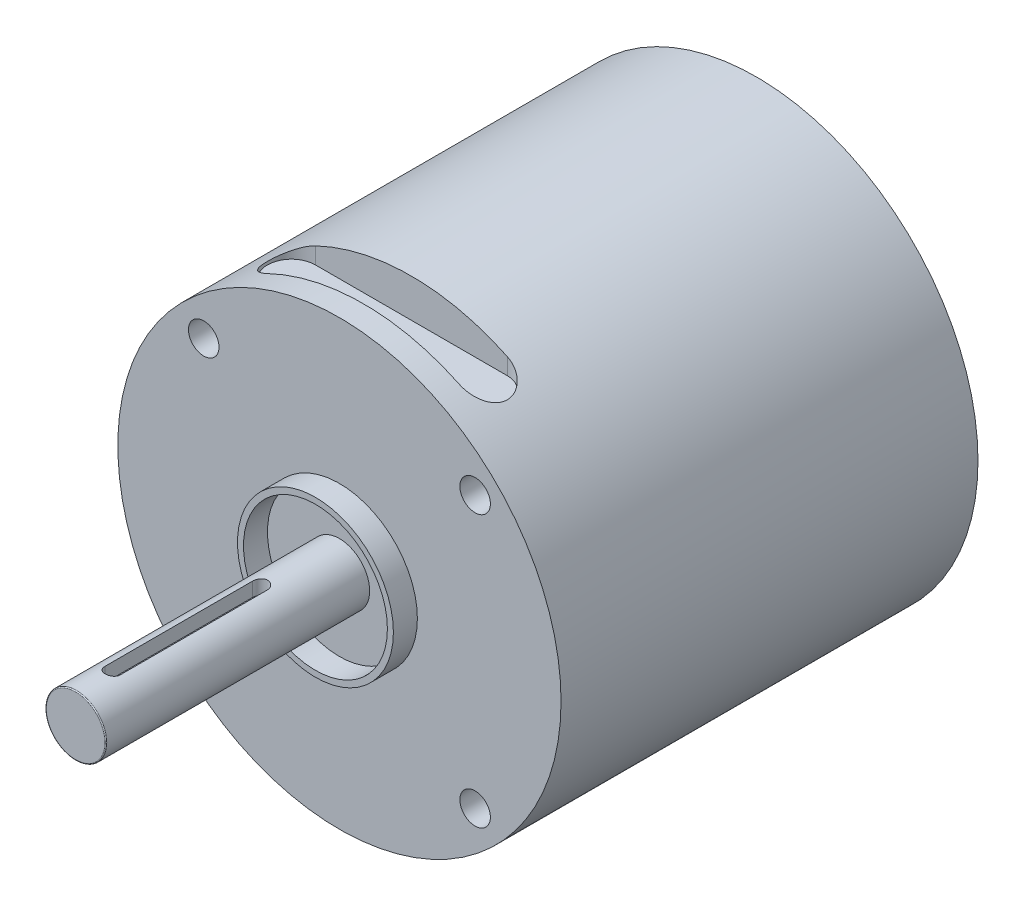
ISO-10303-21;
HEADER;
FILE_DESCRIPTION(('STEP AP214'),'2;1');
FILE_NAME('part.step','',(''),(''),'','','');
FILE_SCHEMA(('AUTOMOTIVE_DESIGN { 1 0 10303 214 1 1 1 1 }'));
ENDSEC;
DATA;
#1=APPLICATION_CONTEXT('core data for automotive mechanical design processes');
#2=APPLICATION_PROTOCOL_DEFINITION('international standard','automotive_design',2000,#1);
#3=PRODUCT_CONTEXT('',#1,'mechanical');
#4=PRODUCT('Part','Part','',(#3));
#5=PRODUCT_RELATED_PRODUCT_CATEGORY('part','',(#4));
#6=PRODUCT_DEFINITION_FORMATION('','',#4);
#7=PRODUCT_DEFINITION_CONTEXT('part definition',#1,'design');
#8=PRODUCT_DEFINITION('design','',#6,#7);
#9=PRODUCT_DEFINITION_SHAPE('','',#8);
#10=(LENGTH_UNIT() NAMED_UNIT(*) SI_UNIT(.MILLI.,.METRE.));
#11=(NAMED_UNIT(*) PLANE_ANGLE_UNIT() SI_UNIT($,.RADIAN.));
#12=(NAMED_UNIT(*) SI_UNIT($,.STERADIAN.) SOLID_ANGLE_UNIT());
#13=UNCERTAINTY_MEASURE_WITH_UNIT(LENGTH_MEASURE(1.E-05),#10,'distance_accuracy_value','');
#14=(GEOMETRIC_REPRESENTATION_CONTEXT(3) GLOBAL_UNCERTAINTY_ASSIGNED_CONTEXT((#13)) GLOBAL_UNIT_ASSIGNED_CONTEXT((#10,
#11,#12)) REPRESENTATION_CONTEXT('',''));
#15=CARTESIAN_POINT('',(0.,0.,0.));
#16=DIRECTION('',(0.,0.,1.));
#17=DIRECTION('',(1.,0.,0.));
#18=AXIS2_PLACEMENT_3D('',#15,#16,#17);
#19=CARTESIAN_POINT('',(0.,0.,55.1942));
#20=DIRECTION('',(0.,0.,-1.));
#21=DIRECTION('',(-1.,0.,0.));
#22=AXIS2_PLACEMENT_3D('',#19,#20,#21);
#23=CYLINDRICAL_SURFACE('',#22,29.337);
#24=CARTESIAN_POINT('',(-12.7,26.4455964009133,52.0192));
#25=CARTESIAN_POINT('',(-12.7999935784026,26.3975802156428,52.0191933741765));
#26=CARTESIAN_POINT('',(-12.899655265305,26.3490169743052,52.0144749423616));
#27=CARTESIAN_POINT('',(-13.0977120096252,26.251127234427,51.9957643735884));
#28=CARTESIAN_POINT('',(-13.1961072165287,26.2018008275064,51.9817733415225));
#29=CARTESIAN_POINT('',(-13.4885884149536,26.0531232640922,51.9261023274076));
#30=CARTESIAN_POINT('',(-13.6799039434946,25.953105530812,51.8707246247511));
#31=CARTESIAN_POINT('',(-14.0496110384805,25.7548462259984,51.7249471615389));
#32=CARTESIAN_POINT('',(-14.2280013685622,25.6566048250532,51.6345440558552));
#33=CARTESIAN_POINT('',(-14.5668381544862,25.4657532274061,51.4201921814478));
#34=CARTESIAN_POINT('',(-14.7272857644863,25.3731426686776,51.2962455721516));
#35=CARTESIAN_POINT('',(-15.0206994706168,25.200523115352,51.0200652959408));
#36=CARTESIAN_POINT('',(-15.1542800023321,25.1202456814382,50.8686661665429));
#37=CARTESIAN_POINT('',(-15.3330664097173,25.0112289116959,50.6212701887228));
#38=CARTESIAN_POINT('',(-15.3890759268016,24.9767826080826,50.5353976668582));
#39=CARTESIAN_POINT('',(-15.4931118185219,24.9123821082004,50.3573926900157));
#40=CARTESIAN_POINT('',(-15.5411441907074,24.8824245387869,50.2652650120195));
#41=CARTESIAN_POINT('',(-15.6226400094675,24.8313248137603,50.0879951492556));
#42=CARTESIAN_POINT('',(-15.6571895301782,24.8095410560846,50.003535122367));
#43=CARTESIAN_POINT('',(-15.7191145403578,24.770352236214,49.8310917216594));
#44=CARTESIAN_POINT('',(-15.7464947056621,24.7529443204042,49.7431106876207));
#45=CARTESIAN_POINT('',(-15.793613952146,24.722906575261,49.5644142848367));
#46=CARTESIAN_POINT('',(-15.8133600487852,24.7102723592969,49.4737015095184));
#47=CARTESIAN_POINT('',(-15.8448728482896,24.6900774961406,49.290347600278));
#48=CARTESIAN_POINT('',(-15.8566408535494,24.6825160208437,49.197706783648));
#49=CARTESIAN_POINT('',(-15.8707954319837,24.6734164087759,49.0257189658045));
#50=CARTESIAN_POINT('',(-15.8743408770911,24.6711343559055,48.9465040132243));
#51=CARTESIAN_POINT('',(-15.8754918636408,24.6703937612768,48.7879846505425));
#52=CARTESIAN_POINT('',(-15.873095509155,24.6719364399259,48.7086802199601));
#53=CARTESIAN_POINT('',(-15.862393935922,24.6788182217864,48.5506819070306));
#54=CARTESIAN_POINT('',(-15.8540922031861,24.6841550852467,48.4719876921579));
#55=CARTESIAN_POINT('',(-15.8317107876766,24.6985156082517,48.3157565640876));
#56=CARTESIAN_POINT('',(-15.8176289171686,24.7075406637409,48.2382201006179));
#57=CARTESIAN_POINT('',(-15.7685698534504,24.7389019726696,48.0154540556941));
#58=CARTESIAN_POINT('',(-15.7262127172989,24.765895142234,47.8724177225665));
#59=CARTESIAN_POINT('',(-15.6230854034192,24.8310783877972,47.5959931113277));
#60=CARTESIAN_POINT('',(-15.5623111550576,24.8692709390736,47.4626069742282));
#61=CARTESIAN_POINT('',(-15.4191329570302,24.9583161461541,47.1975737742838));
#62=CARTESIAN_POINT('',(-15.3353941296849,25.0099335771814,47.0669068992655));
#63=CARTESIAN_POINT('',(-15.1519667889344,25.1214847173408,46.8213274577803));
#64=CARTESIAN_POINT('',(-15.0522715643893,25.1814219242936,46.7064215581905));
#65=CARTESIAN_POINT('',(-14.8243229278951,25.3163768248014,46.4783063228865));
#66=CARTESIAN_POINT('',(-14.6940243605106,25.392325252936,46.3676912994898));
#67=CARTESIAN_POINT('',(-14.4194332344039,25.5492575938961,46.1697153252365));
#68=CARTESIAN_POINT('',(-14.2751273190822,25.6302462858955,46.0823768727172));
#69=CARTESIAN_POINT('',(-13.9559285950078,25.8055997464604,45.9220005065732));
#70=CARTESIAN_POINT('',(-13.7795132413707,25.9003184362395,45.8523747262066));
#71=CARTESIAN_POINT('',(-13.4173437426021,26.0897695280235,45.7455568850322));
#72=CARTESIAN_POINT('',(-13.2316032729116,26.1845017178784,45.7083187166721));
#73=CARTESIAN_POINT('',(-12.9866509678586,26.3060935691882,45.6816458527838));
#74=CARTESIAN_POINT('',(-12.9294834567776,26.33423844317,45.6769827861394));
#75=CARTESIAN_POINT('',(-12.8149141345213,26.3901797017715,45.6707634363677));
#76=CARTESIAN_POINT('',(-12.75751278982,26.4179765368737,45.6692026077315));
#77=CARTESIAN_POINT('',(-12.7,26.4455964009133,45.6692));
#78=B_SPLINE_CURVE_WITH_KNOTS('',3,(#24,#25,#26,#27,#28,#29,#30,#31,#32,#33,#34,#35,#36,#37,#38,
#39,#40,#41,#42,#43,#44,#45,#46,#47,#48,#49,#50,#51,#52,#53,#54,#55,#56,#57,#58,#59,#60,#61,#62,
#63,#64,#65,#66,#67,#68,#69,#70,#71,#72,#73,#74,#75,#76,#77),.UNSPECIFIED.,.F.,.F.,(4,2,2,2,2,2,
2,2,2,2,2,2,2,2,2,2,2,2,2,2,2,2,2,2,2,2,4),(0.,0.332553575484437,0.665067532104771,
1.33031251349744,1.99562104528934,2.6608867567471,3.30856322637882,3.63256557852423,
3.95632321849284,4.23736333801693,4.51821970475738,4.7988173566721,5.0793691909883,
5.31704559454929,5.55479784640062,5.79240986676206,6.03011190436765,6.48277455833337,
6.93553733490952,7.42427299713629,7.91321476068804,8.47210338670218,9.03153027210796,
9.66484158612201,10.2972498247154,10.4888676553786,10.6802045132141),.UNSPECIFIED.);
#79=CARTESIAN_POINT('',(-12.7,26.4455964009133,52.0192));
#80=VERTEX_POINT('',#79);
#81=CARTESIAN_POINT('',(-12.7,26.4455964009133,45.6692));
#82=VERTEX_POINT('',#81);
#83=EDGE_CURVE('E250',#80,#82,#78,.T.);
#84=ORIENTED_EDGE('',*,*,#83,.T.);
#85=CARTESIAN_POINT('',(0.,0.,45.6692));
#86=DIRECTION('',(0.,0.,-1.));
#87=DIRECTION('',(-1.,0.,0.));
#88=AXIS2_PLACEMENT_3D('',#85,#86,#87);
#89=CIRCLE('',#88,29.337);
#90=CARTESIAN_POINT('',(12.7,26.4455964009133,45.6692));
#91=VERTEX_POINT('',#90);
#92=EDGE_CURVE('E233',#82,#91,#89,.T.);
#93=ORIENTED_EDGE('',*,*,#92,.T.);
#94=CARTESIAN_POINT('',(12.7,26.4455964009133,45.6692));
#95=CARTESIAN_POINT('',(12.7999935784026,26.3975802156428,45.6692066258235));
#96=CARTESIAN_POINT('',(12.899655265305,26.3490169743052,45.6739250576384));
#97=CARTESIAN_POINT('',(13.0977120096252,26.251127234427,45.6926356264116));
#98=CARTESIAN_POINT('',(13.1961072165287,26.2018008275064,45.7066266584775));
#99=CARTESIAN_POINT('',(13.4885884149536,26.0531232640922,45.7622976725924));
#100=CARTESIAN_POINT('',(13.6799039434946,25.953105530812,45.8176753752489));
#101=CARTESIAN_POINT('',(14.0496110384805,25.7548462259984,45.9634528384611));
#102=CARTESIAN_POINT('',(14.2280013685622,25.6566048250532,46.0538559441448));
#103=CARTESIAN_POINT('',(14.5668381544862,25.4657532274061,46.2682078185523));
#104=CARTESIAN_POINT('',(14.7272857644863,25.3731426686776,46.3921544278484));
#105=CARTESIAN_POINT('',(15.0206994706168,25.200523115352,46.6683347040592));
#106=CARTESIAN_POINT('',(15.1542800023321,25.1202456814382,46.8197338334571));
#107=CARTESIAN_POINT('',(15.3330664097173,25.0112289116959,47.0671298112772));
#108=CARTESIAN_POINT('',(15.3890759268016,24.9767826080826,47.1530023331418));
#109=CARTESIAN_POINT('',(15.4931118185219,24.9123821082004,47.3310073099843));
#110=CARTESIAN_POINT('',(15.5411441907074,24.8824245387869,47.4231349879805));
#111=CARTESIAN_POINT('',(15.6226400094675,24.8313248137603,47.6004048507444));
#112=CARTESIAN_POINT('',(15.6571895301782,24.8095410560846,47.684864877633));
#113=CARTESIAN_POINT('',(15.7191145403578,24.770352236214,47.8573082783406));
#114=CARTESIAN_POINT('',(15.7464947056621,24.7529443204042,47.9452893123793));
#115=CARTESIAN_POINT('',(15.793613952146,24.722906575261,48.1239857151633));
#116=CARTESIAN_POINT('',(15.8133600487852,24.7102723592969,48.2146984904816));
#117=CARTESIAN_POINT('',(15.8448728482896,24.6900774961406,48.398052399722));
#118=CARTESIAN_POINT('',(15.8566408535494,24.6825160208437,48.490693216352));
#119=CARTESIAN_POINT('',(15.8707954319837,24.6734164087759,48.6626810341955));
#120=CARTESIAN_POINT('',(15.8743408770911,24.6711343559055,48.7418959867757));
#121=CARTESIAN_POINT('',(15.8754918636408,24.6703937612768,48.9004153494575));
#122=CARTESIAN_POINT('',(15.873095509155,24.6719364399259,48.9797197800399));
#123=CARTESIAN_POINT('',(15.862393935922,24.6788182217864,49.1377180929694));
#124=CARTESIAN_POINT('',(15.8540922031861,24.6841550852467,49.2164123078421));
#125=CARTESIAN_POINT('',(15.8317107876766,24.6985156082517,49.3726434359124));
#126=CARTESIAN_POINT('',(15.8176289171686,24.7075406637409,49.4501798993821));
#127=CARTESIAN_POINT('',(15.7685698534504,24.7389019726696,49.6729459443059));
#128=CARTESIAN_POINT('',(15.7262127172989,24.765895142234,49.8159822774335));
#129=CARTESIAN_POINT('',(15.6230854034192,24.8310783877972,50.0924068886724));
#130=CARTESIAN_POINT('',(15.5623111550576,24.8692709390736,50.2257930257718));
#131=CARTESIAN_POINT('',(15.4191329570302,24.9583161461541,50.4908262257162));
#132=CARTESIAN_POINT('',(15.3353941296849,25.0099335771814,50.6214931007345));
#133=CARTESIAN_POINT('',(15.1519667889344,25.1214847173408,50.8670725422197));
#134=CARTESIAN_POINT('',(15.0522715643893,25.1814219242936,50.9819784418095));
#135=CARTESIAN_POINT('',(14.8243229278951,25.3163768248014,51.2100936771135));
#136=CARTESIAN_POINT('',(14.6940243605106,25.392325252936,51.3207087005102));
#137=CARTESIAN_POINT('',(14.4194332344039,25.5492575938961,51.5186846747635));
#138=CARTESIAN_POINT('',(14.2751273190822,25.6302462858955,51.6060231272828));
#139=CARTESIAN_POINT('',(13.9559285950078,25.8055997464604,51.7663994934268));
#140=CARTESIAN_POINT('',(13.7795132413707,25.9003184362395,51.8360252737934));
#141=CARTESIAN_POINT('',(13.4173437426021,26.0897695280235,51.9428431149678));
#142=CARTESIAN_POINT('',(13.2316032729116,26.1845017178784,51.9800812833279));
#143=CARTESIAN_POINT('',(12.9866509678586,26.3060935691882,52.0067541472162));
#144=CARTESIAN_POINT('',(12.9294834567776,26.33423844317,52.0114172138606));
#145=CARTESIAN_POINT('',(12.8149141345213,26.3901797017715,52.0176365636323));
#146=CARTESIAN_POINT('',(12.75751278982,26.4179765368737,52.0191973922685));
#147=CARTESIAN_POINT('',(12.7,26.4455964009133,52.0192));
#148=B_SPLINE_CURVE_WITH_KNOTS('',3,(#94,#95,#96,#97,#98,#99,#100,#101,#102,#103,#104,#105,#106,
#107,#108,#109,#110,#111,#112,#113,#114,#115,#116,#117,#118,#119,#120,#121,#122,#123,#124,#125,
#126,#127,#128,#129,#130,#131,#132,#133,#134,#135,#136,#137,#138,#139,#140,#141,#142,#143,#144,
#145,#146,#147),.UNSPECIFIED.,.F.,.F.,(4,2,2,2,2,2,2,2,2,2,2,2,2,2,2,2,2,2,2,2,2,2,2,2,2,2,4),
(0.,0.332553575484437,0.665067532104771,1.33031251349744,1.99562104528935,2.66088675674711,
3.30856322637883,3.63256557852423,3.95632321849284,4.23736333801693,4.51821970475738,
4.7988173566721,5.0793691909883,5.31704559454929,5.55479784640062,5.79240986676206,
6.03011190436765,6.48277455833337,6.93553733490952,7.42427299713629,7.91321476068804,
8.47210338670219,9.03153027210796,9.66484158612201,10.2972498247154,10.4888676553786,
10.6802045132141),.UNSPECIFIED.);
#149=CARTESIAN_POINT('',(12.7,26.4455964009133,52.0192));
#150=VERTEX_POINT('',#149);
#151=EDGE_CURVE('E241',#91,#150,#148,.T.);
#152=ORIENTED_EDGE('',*,*,#151,.T.);
#153=CARTESIAN_POINT('',(0.,0.,52.0192));
#154=DIRECTION('',(0.,0.,1.));
#155=DIRECTION('',(1.,0.,0.));
#156=AXIS2_PLACEMENT_3D('',#153,#154,#155);
#157=CIRCLE('',#156,29.337);
#158=EDGE_CURVE('E237',#150,#80,#157,.T.);
#159=ORIENTED_EDGE('',*,*,#158,.T.);
#160=EDGE_LOOP('',(#84,#93,#152,#159));
#161=FACE_BOUND('',#160,.T.);
#162=CARTESIAN_POINT('',(0.,0.,55.1942));
#163=DIRECTION('',(0.,0.,1.));
#164=DIRECTION('',(1.,0.,0.));
#165=AXIS2_PLACEMENT_3D('',#162,#163,#164);
#166=CIRCLE('',#165,29.337);
#167=CARTESIAN_POINT('',(29.337,0.,55.1942));
#168=VERTEX_POINT('',#167);
#169=EDGE_CURVE('E222',#168,#168,#166,.T.);
#170=ORIENTED_EDGE('',*,*,#169,.F.);
#171=EDGE_LOOP('',(#170));
#172=FACE_BOUND('',#171,.T.);
#173=CARTESIAN_POINT('',(0.,0.,0.));
#174=DIRECTION('',(0.,0.,1.));
#175=DIRECTION('',(1.,0.,0.));
#176=AXIS2_PLACEMENT_3D('',#173,#174,#175);
#177=CIRCLE('',#176,29.337);
#178=CARTESIAN_POINT('',(29.337,0.,0.));
#179=VERTEX_POINT('',#178);
#180=EDGE_CURVE('E218',#179,#179,#177,.T.);
#181=ORIENTED_EDGE('',*,*,#180,.T.);
#182=EDGE_LOOP('',(#181));
#183=FACE_BOUND('',#182,.T.);
#184=ADVANCED_FACE('F38',(#161,#172,#183),#23,.T.);
#185=CARTESIAN_POINT('',(0.,0.,55.1942));
#186=DIRECTION('',(0.,0.,1.));
#187=DIRECTION('',(1.,0.,0.));
#188=AXIS2_PLACEMENT_3D('',#185,#186,#187);
#189=PLANE('',#188);
#190=CARTESIAN_POINT('',(17.9605122421384,17.9605122421382,55.1942));
#191=DIRECTION('',(0.,0.,1.));
#192=DIRECTION('',(1.,0.,0.));
#193=AXIS2_PLACEMENT_3D('',#190,#191,#192);
#194=CIRCLE('',#193,2.0193);
#195=CARTESIAN_POINT('',(19.9798122421384,17.9605122421382,55.1942));
#196=VERTEX_POINT('',#195);
#197=EDGE_CURVE('E163',#196,#196,#194,.T.);
#198=ORIENTED_EDGE('',*,*,#197,.F.);
#199=EDGE_LOOP('',(#198));
#200=FACE_BOUND('',#199,.T.);
#201=CARTESIAN_POINT('',(-17.9605122421383,17.9605122421383,55.1942));
#202=DIRECTION('',(0.,0.,1.));
#203=DIRECTION('',(1.,0.,0.));
#204=AXIS2_PLACEMENT_3D('',#201,#202,#203);
#205=CIRCLE('',#204,2.0193);
#206=CARTESIAN_POINT('',(-15.9412122421383,17.9605122421383,55.1942));
#207=VERTEX_POINT('',#206);
#208=EDGE_CURVE('E187',#207,#207,#205,.T.);
#209=ORIENTED_EDGE('',*,*,#208,.F.);
#210=EDGE_LOOP('',(#209));
#211=FACE_BOUND('',#210,.T.);
#212=CARTESIAN_POINT('',(-17.9605122421383,-17.9605122421383,55.1942));
#213=DIRECTION('',(0.,0.,1.));
#214=DIRECTION('',(1.,0.,0.));
#215=AXIS2_PLACEMENT_3D('',#212,#213,#214);
#216=CIRCLE('',#215,2.0193);
#217=CARTESIAN_POINT('',(-15.9412122421383,-17.9605122421383,55.1942));
#218=VERTEX_POINT('',#217);
#219=EDGE_CURVE('E179',#218,#218,#216,.T.);
#220=ORIENTED_EDGE('',*,*,#219,.F.);
#221=EDGE_LOOP('',(#220));
#222=FACE_BOUND('',#221,.T.);
#223=CARTESIAN_POINT('',(17.9605122421383,-17.9605122421383,55.1942));
#224=DIRECTION('',(0.,0.,1.));
#225=DIRECTION('',(1.,0.,0.));
#226=AXIS2_PLACEMENT_3D('',#223,#224,#225);
#227=CIRCLE('',#226,2.0193);
#228=CARTESIAN_POINT('',(19.9798122421383,-17.9605122421383,55.1942));
#229=VERTEX_POINT('',#228);
#230=EDGE_CURVE('E178',#229,#229,#227,.T.);
#231=ORIENTED_EDGE('',*,*,#230,.F.);
#232=EDGE_LOOP('',(#231));
#233=FACE_BOUND('',#232,.T.);
#234=CARTESIAN_POINT('',(0.,0.,55.1942));
#235=DIRECTION('',(0.,0.,1.));
#236=DIRECTION('',(1.,0.,0.));
#237=AXIS2_PLACEMENT_3D('',#234,#235,#236);
#238=CIRCLE('',#237,10.31875);
#239=CARTESIAN_POINT('',(10.31875,0.,55.1942));
#240=VERTEX_POINT('',#239);
#241=EDGE_CURVE('E213',#240,#240,#238,.T.);
#242=ORIENTED_EDGE('',*,*,#241,.F.);
#243=EDGE_LOOP('',(#242));
#244=FACE_BOUND('',#243,.T.);
#245=ORIENTED_EDGE('',*,*,#169,.T.);
#246=EDGE_LOOP('',(#245));
#247=FACE_BOUND('',#246,.T.);
#248=ADVANCED_FACE('F347',(#200,#211,#222,#233,#244,#247),#189,.T.);
#249=CARTESIAN_POINT('',(0.,0.,0.));
#250=DIRECTION('',(0.,0.,1.));
#251=DIRECTION('',(1.,0.,0.));
#252=AXIS2_PLACEMENT_3D('',#249,#250,#251);
#253=PLANE('',#252);
#254=ORIENTED_EDGE('',*,*,#180,.F.);
#255=EDGE_LOOP('',(#254));
#256=FACE_BOUND('',#255,.T.);
#257=ADVANCED_FACE('F352',(#256),#253,.F.);
#258=CARTESIAN_POINT('',(0.,0.,58.3692));
#259=DIRECTION('',(0.,0.,1.));
#260=DIRECTION('',(1.,0.,0.));
#261=AXIS2_PLACEMENT_3D('',#258,#259,#260);
#262=PLANE('',#261);
#263=CARTESIAN_POINT('',(0.,0.,58.3692));
#264=DIRECTION('',(0.,0.,1.));
#265=DIRECTION('',(1.,0.,0.));
#266=AXIS2_PLACEMENT_3D('',#263,#264,#265);
#267=CIRCLE('',#266,10.31875);
#268=CARTESIAN_POINT('',(10.31875,0.,58.3692));
#269=VERTEX_POINT('',#268);
#270=EDGE_CURVE('E214',#269,#269,#267,.T.);
#271=ORIENTED_EDGE('',*,*,#270,.T.);
#272=EDGE_LOOP('',(#271));
#273=FACE_BOUND('',#272,.T.);
#274=CARTESIAN_POINT('',(0.,0.,58.3692));
#275=DIRECTION('',(0.,0.,1.));
#276=DIRECTION('',(1.,0.,0.));
#277=AXIS2_PLACEMENT_3D('',#274,#275,#276);
#278=CIRCLE('',#277,9.525);
#279=CARTESIAN_POINT('',(9.525,0.,58.3692));
#280=VERTEX_POINT('',#279);
#281=EDGE_CURVE('E209',#280,#280,#278,.T.);
#282=ORIENTED_EDGE('',*,*,#281,.F.);
#283=EDGE_LOOP('',(#282));
#284=FACE_BOUND('',#283,.T.);
#285=ADVANCED_FACE('F362',(#273,#284),#262,.T.);
#286=CARTESIAN_POINT('',(0.,0.,58.3692));
#287=DIRECTION('',(0.,0.,-1.));
#288=DIRECTION('',(-1.,0.,0.));
#289=AXIS2_PLACEMENT_3D('',#286,#287,#288);
#290=CYLINDRICAL_SURFACE('',#289,10.31875);
#291=ORIENTED_EDGE('',*,*,#270,.F.);
#292=EDGE_LOOP('',(#291));
#293=FACE_BOUND('',#292,.T.);
#294=ORIENTED_EDGE('',*,*,#241,.T.);
#295=EDGE_LOOP('',(#294));
#296=FACE_BOUND('',#295,.T.);
#297=ADVANCED_FACE('F366',(#293,#296),#290,.T.);
#298=CARTESIAN_POINT('',(0.,0.,58.3692));
#299=DIRECTION('',(0.,0.,-1.));
#300=DIRECTION('',(-1.,0.,0.));
#301=AXIS2_PLACEMENT_3D('',#298,#299,#300);
#302=CYLINDRICAL_SURFACE('',#301,9.525);
#303=ORIENTED_EDGE('',*,*,#281,.T.);
#304=EDGE_LOOP('',(#303));
#305=FACE_BOUND('',#304,.T.);
#306=CARTESIAN_POINT('',(0.,0.,55.1942));
#307=DIRECTION('',(0.,0.,1.));
#308=DIRECTION('',(1.,0.,0.));
#309=AXIS2_PLACEMENT_3D('',#306,#307,#308);
#310=CIRCLE('',#309,9.525);
#311=CARTESIAN_POINT('',(9.525,0.,55.1942));
#312=VERTEX_POINT('',#311);
#313=EDGE_CURVE('E226',#312,#312,#310,.F.);
#314=ORIENTED_EDGE('',*,*,#313,.T.);
#315=EDGE_LOOP('',(#314));
#316=FACE_BOUND('',#315,.T.);
#317=ADVANCED_FACE('F309',(#305,#316),#302,.F.);
#318=CARTESIAN_POINT('',(0.,0.,55.1942));
#319=DIRECTION('',(0.,0.,1.));
#320=DIRECTION('',(1.,0.,0.));
#321=AXIS2_PLACEMENT_3D('',#318,#319,#320);
#322=CIRCLE('',#321,4.0005);
#323=CARTESIAN_POINT('',(4.0005,0.,55.1942));
#324=VERTEX_POINT('',#323);
#325=EDGE_CURVE('E202',#324,#324,#322,.T.);
#326=ORIENTED_EDGE('',*,*,#325,.F.);
#327=EDGE_LOOP('',(#326));
#328=FACE_BOUND('',#327,.T.);
#329=ORIENTED_EDGE('',*,*,#313,.F.);
#330=EDGE_LOOP('',(#329));
#331=FACE_BOUND('',#330,.T.);
#332=ADVANCED_FACE('F307',(#328,#331),#189,.T.);
#333=CARTESIAN_POINT('',(0.,0.,90.1192));
#334=DIRECTION('',(0.,0.,-1.));
#335=DIRECTION('',(-1.,0.,0.));
#336=AXIS2_PLACEMENT_3D('',#333,#334,#335);
#337=CYLINDRICAL_SURFACE('',#336,4.0005);
#338=CARTESIAN_POINT('',(0.,0.,89.9922));
#339=DIRECTION('',(0.,0.,1.));
#340=DIRECTION('',(1.,0.,0.));
#341=AXIS2_PLACEMENT_3D('',#338,#339,#340);
#342=CIRCLE('',#341,4.0005);
#343=CARTESIAN_POINT('',(4.0005,0.,89.9922));
#344=VERTEX_POINT('',#343);
#345=EDGE_CURVE('E11',#344,#344,#342,.F.);
#346=ORIENTED_EDGE('',*,*,#345,.T.);
#347=EDGE_LOOP('',(#346));
#348=FACE_BOUND('',#347,.T.);
#349=DIRECTION('',(0.,0.,-1.));
#350=VECTOR('',#349,1.);
#351=CARTESIAN_POINT('',(0.999490000000003,3.87363136990344,90.1192));
#352=LINE('',#351,#350);
#353=CARTESIAN_POINT('',(0.99949,3.87363136990344,65.71869));
#354=VERTEX_POINT('',#353);
#355=CARTESIAN_POINT('',(0.999490000000003,3.87363136990344,85.21827));
#356=VERTEX_POINT('',#355);
#357=EDGE_CURVE('E514',#354,#356,#352,.F.);
#358=ORIENTED_EDGE('',*,*,#357,.T.);
#359=CARTESIAN_POINT('',(0.999490000000003,3.87363136990344,85.21827));
#360=CARTESIAN_POINT('',(0.999490336657385,3.87362951188948,85.2459194802107));
#361=CARTESIAN_POINT('',(0.998341943076873,3.87392778392156,85.2735552605472));
#362=CARTESIAN_POINT('',(0.993763965451635,3.87510538487985,85.328620150634));
#363=CARTESIAN_POINT('',(0.99033476489969,3.87598461612395,85.356049294344));
#364=CARTESIAN_POINT('',(0.976675843593679,3.87945847662148,85.4376162090511));
#365=CARTESIAN_POINT('',(0.963074584373091,3.88288949008794,85.4911934861047));
#366=CARTESIAN_POINT('',(0.927321371874048,3.89158181859179,85.5952112444891));
#367=CARTESIAN_POINT('',(0.905170215897197,3.89684296295988,85.6456520177984));
#368=CARTESIAN_POINT('',(0.852972525073699,3.90859969592365,85.742126723222));
#369=CARTESIAN_POINT('',(0.822923877611626,3.91509561469831,85.7881594716672));
#370=CARTESIAN_POINT('',(0.75508682728949,3.92874805666299,85.8754927628773));
#371=CARTESIAN_POINT('',(0.717157823723819,3.93591505973632,85.9166824268387));
#372=CARTESIAN_POINT('',(0.634936019109444,3.95001185088161,85.9921901716833));
#373=CARTESIAN_POINT('',(0.590642202906999,3.95694160089423,86.0265071543163));
#374=CARTESIAN_POINT('',(0.496185673955462,3.96989928937373,86.0877475979555));
#375=CARTESIAN_POINT('',(0.44594982155243,3.97591332543138,86.1145614425506));
#376=CARTESIAN_POINT('',(0.341510978335119,3.98624131331918,86.1593208036207));
#377=CARTESIAN_POINT('',(0.287308769997954,3.99055559940722,86.1772680638967));
#378=CARTESIAN_POINT('',(0.177636764078971,3.99692384968741,86.2034293416259));
#379=CARTESIAN_POINT('',(0.12221475877951,3.99902175438766,86.2118328305127));
#380=CARTESIAN_POINT('',(0.0107093260605478,4.00087400669315,86.2192628163176));
#381=CARTESIAN_POINT('',(-0.0453740174645537,4.0006286484269,86.2182904900964));
#382=CARTESIAN_POINT('',(-0.15529353033413,3.99785464175442,86.2071323787797));
#383=CARTESIAN_POINT('',(-0.20915195454355,3.9953767299273,86.1971513155793));
#384=CARTESIAN_POINT('',(-0.314403412140822,3.98847514610806,86.1685882123255));
#385=CARTESIAN_POINT('',(-0.365796336415909,3.98405138808882,86.1500057919984));
#386=CARTESIAN_POINT('',(-0.465198618552703,3.97367747337115,86.1046014993875));
#387=CARTESIAN_POINT('',(-0.513173175550597,3.96771387501397,86.0777066362833));
#388=CARTESIAN_POINT('',(-0.603998720213812,3.95490740568275,86.0164967782892));
#389=CARTESIAN_POINT('',(-0.646848935652934,3.94806440250602,85.9821806672175));
#390=CARTESIAN_POINT('',(-0.727427059228485,3.93402718574054,85.9060096657407));
#391=CARTESIAN_POINT('',(-0.764985972756125,3.92682847671298,85.8639766621839));
#392=CARTESIAN_POINT('',(-0.832568352011385,3.91305807744536,85.7741211681236));
#393=CARTESIAN_POINT('',(-0.862589755092617,3.90648655914088,85.7262970981853));
#394=CARTESIAN_POINT('',(-0.914355236356151,3.89469716821051,85.6258780066987));
#395=CARTESIAN_POINT('',(-0.936053996826417,3.88948675462008,85.5732587428752));
#396=CARTESIAN_POINT('',(-0.970217027833164,3.88110728727896,85.4649887010299));
#397=CARTESIAN_POINT('',(-0.982695102704905,3.87793518289766,85.4093425891676));
#398=CARTESIAN_POINT('',(-0.993401138297659,3.87519819648114,85.3307239779194));
#399=CARTESIAN_POINT('',(-0.995684856632679,3.8746115434389,85.3082793007841));
#400=CARTESIAN_POINT('',(-0.998727572785548,3.87382830451842,85.2633166395158));
#401=CARTESIAN_POINT('',(-0.999489037907638,3.87363108743947,85.2407988333568));
#402=CARTESIAN_POINT('',(-0.999489999999998,3.87363136990344,85.21827));
#403=B_SPLINE_CURVE_WITH_KNOTS('',3,(#359,#360,#361,#362,#363,#364,#365,#366,#367,#368,#369,
#370,#371,#372,#373,#374,#375,#376,#377,#378,#379,#380,#381,#382,#383,#384,#385,#386,#387,#388,
#389,#390,#391,#392,#393,#394,#395,#396,#397,#398,#399,#400,#401,#402),.UNSPECIFIED.,.F.,.F.,(4,
2,2,2,2,2,2,2,2,2,2,2,2,2,2,2,2,2,2,2,2,4),(0.,0.0828960432388733,0.165778151935795,
0.33106856992215,0.496343577840745,0.661662842665857,0.830233579602076,0.998831232577583,
1.16977675662229,1.34068864722201,1.50814464299161,1.6755796198068,1.83930289591959,
2.0030334110716,2.16824456301353,2.33348058059651,2.50316584438037,2.67289749219969,
2.84354065330574,3.01392782319597,3.08158843724927,3.14913929616532),.UNSPECIFIED.);
#404=CARTESIAN_POINT('',(-0.999489999999998,3.87363136990344,85.21827));
#405=VERTEX_POINT('',#404);
#406=EDGE_CURVE('E312',#356,#405,#403,.T.);
#407=ORIENTED_EDGE('',*,*,#406,.T.);
#408=DIRECTION('',(0.,0.,-1.));
#409=VECTOR('',#408,1.);
#410=CARTESIAN_POINT('',(-0.999489999999997,3.87363136990344,90.1192));
#411=LINE('',#410,#409);
#412=CARTESIAN_POINT('',(-0.999489999999997,3.87363136990344,65.71869));
#413=VERTEX_POINT('',#412);
#414=EDGE_CURVE('E326',#405,#413,#411,.T.);
#415=ORIENTED_EDGE('',*,*,#414,.T.);
#416=CARTESIAN_POINT('',(-0.99949,3.87363136990344,65.71869));
#417=CARTESIAN_POINT('',(-0.999490336657383,3.87362951188948,65.6910405197892));
#418=CARTESIAN_POINT('',(-0.998341943076871,3.87392778392156,65.6634047394528));
#419=CARTESIAN_POINT('',(-0.993763965451631,3.87510538487985,65.608339849366));
#420=CARTESIAN_POINT('',(-0.990334764899686,3.87598461612395,65.5809107056559));
#421=CARTESIAN_POINT('',(-0.976675843593674,3.87945847662148,65.4993437909489));
#422=CARTESIAN_POINT('',(-0.963074584373087,3.88288949008794,65.4457665138953));
#423=CARTESIAN_POINT('',(-0.927321371874042,3.8915818185918,65.3417487555109));
#424=CARTESIAN_POINT('',(-0.905170215897186,3.89684296295989,65.2913079822016));
#425=CARTESIAN_POINT('',(-0.852972525073684,3.90859969592366,65.1948332767779));
#426=CARTESIAN_POINT('',(-0.822923877611616,3.91509561469831,65.1488005283328));
#427=CARTESIAN_POINT('',(-0.755086827289485,3.92874805666299,65.0614672371226));
#428=CARTESIAN_POINT('',(-0.717157823723814,3.93591505973633,65.0202775731612));
#429=CARTESIAN_POINT('',(-0.634936019109438,3.95001185088161,64.9447698283167));
#430=CARTESIAN_POINT('',(-0.590642202906993,3.95694160089423,64.9104528456837));
#431=CARTESIAN_POINT('',(-0.49618567395546,3.96989928937373,64.8492124020445));
#432=CARTESIAN_POINT('',(-0.445949821552431,3.97591332543138,64.8223985574494));
#433=CARTESIAN_POINT('',(-0.34151097833512,3.98624131331918,64.7776391963793));
#434=CARTESIAN_POINT('',(-0.287308769997953,3.99055559940723,64.7596919361032));
#435=CARTESIAN_POINT('',(-0.177636764078968,3.99692384968741,64.7335306583741));
#436=CARTESIAN_POINT('',(-0.122214758779507,3.99902175438766,64.7251271694872));
#437=CARTESIAN_POINT('',(-0.0107093260605449,4.00087400669315,64.7176971836824));
#438=CARTESIAN_POINT('',(0.0453740174645563,4.0006286484269,64.7186695099036));
#439=CARTESIAN_POINT('',(0.155293530334132,3.99785464175442,64.7298276212203));
#440=CARTESIAN_POINT('',(0.209151954543552,3.9953767299273,64.7398086844206));
#441=CARTESIAN_POINT('',(0.314403412140824,3.98847514610806,64.7683717876745));
#442=CARTESIAN_POINT('',(0.365796336415911,3.98405138808882,64.7869542080015));
#443=CARTESIAN_POINT('',(0.465198618552708,3.97367747337115,64.8323585006125));
#444=CARTESIAN_POINT('',(0.513173175550604,3.96771387501397,64.8592533637167));
#445=CARTESIAN_POINT('',(0.60399872021382,3.95490740568275,64.9204632217108));
#446=CARTESIAN_POINT('',(0.646848935652939,3.94806440250602,64.9547793327825));
#447=CARTESIAN_POINT('',(0.727427059228484,3.93402718574054,65.0309503342593));
#448=CARTESIAN_POINT('',(0.764985972756122,3.92682847671298,65.0729833378161));
#449=CARTESIAN_POINT('',(0.832568352011382,3.91305807744536,65.1628388318763));
#450=CARTESIAN_POINT('',(0.862589755092618,3.90648655914088,65.2106629018146));
#451=CARTESIAN_POINT('',(0.914355236356155,3.89469716821051,65.3110819933013));
#452=CARTESIAN_POINT('',(0.93605399682642,3.88948675462008,65.3637012571247));
#453=CARTESIAN_POINT('',(0.970217027833166,3.88110728727896,65.47197129897));
#454=CARTESIAN_POINT('',(0.982695102704907,3.87793518289766,65.5276174108324));
#455=CARTESIAN_POINT('',(0.99340113829766,3.87519819648114,65.6062360220805));
#456=CARTESIAN_POINT('',(0.99568485663268,3.8746115434389,65.6286806992158));
#457=CARTESIAN_POINT('',(0.99872757278555,3.87382830451842,65.6736433604842));
#458=CARTESIAN_POINT('',(0.999489037907641,3.87363108743947,65.6961611666432));
#459=CARTESIAN_POINT('',(0.99949,3.87363136990344,65.71869));
#460=B_SPLINE_CURVE_WITH_KNOTS('',3,(#416,#417,#418,#419,#420,#421,#422,#423,#424,#425,#426,
#427,#428,#429,#430,#431,#432,#433,#434,#435,#436,#437,#438,#439,#440,#441,#442,#443,#444,#445,
#446,#447,#448,#449,#450,#451,#452,#453,#454,#455,#456,#457,#458,#459),.UNSPECIFIED.,.F.,.F.,(4,
2,2,2,2,2,2,2,2,2,2,2,2,2,2,2,2,2,2,2,2,4),(0.,0.0828960432388872,0.165778151935809,
0.33106856992215,0.496343577840776,0.661662842665857,0.83023357960209,0.998831232577584,
1.16977675662229,1.34068864722201,1.50814464299162,1.6755796198068,1.83930289591959,
2.0030334110716,2.16824456301354,2.33348058059651,2.50316584438036,2.6728974921997,
2.84354065330574,3.01392782319597,3.08158843724926,3.14913929616532),.UNSPECIFIED.);
#461=EDGE_CURVE('E54',#413,#354,#460,.T.);
#462=ORIENTED_EDGE('',*,*,#461,.T.);
#463=EDGE_LOOP('',(#358,#407,#415,#462));
#464=FACE_BOUND('',#463,.T.);
#465=ORIENTED_EDGE('',*,*,#325,.T.);
#466=EDGE_LOOP('',(#465));
#467=FACE_BOUND('',#466,.T.);
#468=ADVANCED_FACE('F302',(#348,#464,#467),#337,.T.);
#469=CARTESIAN_POINT('',(0.,0.,90.1192));
#470=DIRECTION('',(0.,0.,1.));
#471=DIRECTION('',(1.,0.,0.));
#472=AXIS2_PLACEMENT_3D('',#469,#470,#471);
#473=PLANE('',#472);
#474=CARTESIAN_POINT('',(0.,0.,90.1192));
#475=DIRECTION('',(0.,0.,1.));
#476=DIRECTION('',(1.,0.,0.));
#477=AXIS2_PLACEMENT_3D('',#474,#475,#476);
#478=CIRCLE('',#477,3.8735);
#479=CARTESIAN_POINT('',(3.8735,0.,90.1192));
#480=VERTEX_POINT('',#479);
#481=EDGE_CURVE('E47',#480,#480,#478,.T.);
#482=ORIENTED_EDGE('',*,*,#481,.T.);
#483=EDGE_LOOP('',(#482));
#484=FACE_BOUND('',#483,.T.);
#485=ADVANCED_FACE('F298',(#484),#473,.T.);
#486=CARTESIAN_POINT('',(17.9605122421383,-17.9605122421383,42.4942));
#487=DIRECTION('',(0.,0.,1.));
#488=DIRECTION('',(1.,0.,0.));
#489=AXIS2_PLACEMENT_3D('',#486,#487,#488);
#490=CYLINDRICAL_SURFACE('',#489,2.0193);
#491=CARTESIAN_POINT('',(17.9605122421383,-17.9605122421383,42.4942));
#492=DIRECTION('',(0.,0.,1.));
#493=DIRECTION('',(1.,0.,0.));
#494=AXIS2_PLACEMENT_3D('',#491,#492,#493);
#495=CIRCLE('',#494,2.0193);
#496=CARTESIAN_POINT('',(19.9798122421383,-17.9605122421383,42.4942));
#497=VERTEX_POINT('',#496);
#498=EDGE_CURVE('E198',#497,#497,#495,.T.);
#499=ORIENTED_EDGE('',*,*,#498,.F.);
#500=EDGE_LOOP('',(#499));
#501=FACE_BOUND('',#500,.T.);
#502=ORIENTED_EDGE('',*,*,#230,.T.);
#503=EDGE_LOOP('',(#502));
#504=FACE_BOUND('',#503,.T.);
#505=ADVANCED_FACE('F294',(#501,#504),#490,.F.);
#506=CARTESIAN_POINT('',(17.9605122421383,-17.9605122421383,42.4942));
#507=DIRECTION('',(0.,0.,1.));
#508=DIRECTION('',(1.,0.,0.));
#509=AXIS2_PLACEMENT_3D('',#506,#507,#508);
#510=PLANE('',#509);
#511=ORIENTED_EDGE('',*,*,#498,.T.);
#512=EDGE_LOOP('',(#511));
#513=FACE_BOUND('',#512,.T.);
#514=ADVANCED_FACE('F276',(#513),#510,.T.);
#515=CARTESIAN_POINT('',(-17.9605122421383,-17.9605122421383,42.4942));
#516=DIRECTION('',(0.,0.,1.));
#517=DIRECTION('',(1.,0.,0.));
#518=AXIS2_PLACEMENT_3D('',#515,#516,#517);
#519=CYLINDRICAL_SURFACE('',#518,2.0193);
#520=CARTESIAN_POINT('',(-17.9605122421383,-17.9605122421383,42.4942));
#521=DIRECTION('',(0.,0.,1.));
#522=DIRECTION('',(1.,0.,0.));
#523=AXIS2_PLACEMENT_3D('',#520,#521,#522);
#524=CIRCLE('',#523,2.0193);
#525=CARTESIAN_POINT('',(-15.9412122421383,-17.9605122421383,42.4942));
#526=VERTEX_POINT('',#525);
#527=EDGE_CURVE('E174',#526,#526,#524,.T.);
#528=ORIENTED_EDGE('',*,*,#527,.F.);
#529=EDGE_LOOP('',(#528));
#530=FACE_BOUND('',#529,.T.);
#531=ORIENTED_EDGE('',*,*,#219,.T.);
#532=EDGE_LOOP('',(#531));
#533=FACE_BOUND('',#532,.T.);
#534=ADVANCED_FACE('F272',(#530,#533),#519,.F.);
#535=CARTESIAN_POINT('',(-17.9605122421383,-17.9605122421383,42.4942));
#536=DIRECTION('',(0.,0.,1.));
#537=DIRECTION('',(1.,0.,0.));
#538=AXIS2_PLACEMENT_3D('',#535,#536,#537);
#539=PLANE('',#538);
#540=ORIENTED_EDGE('',*,*,#527,.T.);
#541=EDGE_LOOP('',(#540));
#542=FACE_BOUND('',#541,.T.);
#543=ADVANCED_FACE('F268',(#542),#539,.T.);
#544=CARTESIAN_POINT('',(-17.9605122421383,17.9605122421383,42.4942));
#545=DIRECTION('',(0.,0.,1.));
#546=DIRECTION('',(1.,0.,0.));
#547=AXIS2_PLACEMENT_3D('',#544,#545,#546);
#548=CYLINDRICAL_SURFACE('',#547,2.0193);
#549=CARTESIAN_POINT('',(-17.9605122421383,17.9605122421383,42.4942));
#550=DIRECTION('',(0.,0.,1.));
#551=DIRECTION('',(1.,0.,0.));
#552=AXIS2_PLACEMENT_3D('',#549,#550,#551);
#553=CIRCLE('',#552,2.0193);
#554=CARTESIAN_POINT('',(-15.9412122421383,17.9605122421383,42.4942));
#555=VERTEX_POINT('',#554);
#556=EDGE_CURVE('E183',#555,#555,#553,.T.);
#557=ORIENTED_EDGE('',*,*,#556,.F.);
#558=EDGE_LOOP('',(#557));
#559=FACE_BOUND('',#558,.T.);
#560=ORIENTED_EDGE('',*,*,#208,.T.);
#561=EDGE_LOOP('',(#560));
#562=FACE_BOUND('',#561,.T.);
#563=ADVANCED_FACE('F271',(#559,#562),#548,.F.);
#564=CARTESIAN_POINT('',(-17.9605122421383,17.9605122421383,42.4942));
#565=DIRECTION('',(0.,0.,1.));
#566=DIRECTION('',(1.,0.,0.));
#567=AXIS2_PLACEMENT_3D('',#564,#565,#566);
#568=PLANE('',#567);
#569=ORIENTED_EDGE('',*,*,#556,.T.);
#570=EDGE_LOOP('',(#569));
#571=FACE_BOUND('',#570,.T.);
#572=ADVANCED_FACE('F278',(#571),#568,.T.);
#573=CARTESIAN_POINT('',(17.9605122421384,17.9605122421382,42.4942));
#574=DIRECTION('',(0.,0.,1.));
#575=DIRECTION('',(1.,0.,0.));
#576=AXIS2_PLACEMENT_3D('',#573,#574,#575);
#577=CYLINDRICAL_SURFACE('',#576,2.0193);
#578=CARTESIAN_POINT('',(17.9605122421384,17.9605122421382,42.4942));
#579=DIRECTION('',(0.,0.,1.));
#580=DIRECTION('',(1.,0.,0.));
#581=AXIS2_PLACEMENT_3D('',#578,#579,#580);
#582=CIRCLE('',#581,2.0193);
#583=CARTESIAN_POINT('',(19.9798122421384,17.9605122421382,42.4942));
#584=VERTEX_POINT('',#583);
#585=EDGE_CURVE('E191',#584,#584,#582,.T.);
#586=ORIENTED_EDGE('',*,*,#585,.F.);
#587=EDGE_LOOP('',(#586));
#588=FACE_BOUND('',#587,.T.);
#589=ORIENTED_EDGE('',*,*,#197,.T.);
#590=EDGE_LOOP('',(#589));
#591=FACE_BOUND('',#590,.T.);
#592=ADVANCED_FACE('F281',(#588,#591),#577,.F.);
#593=CARTESIAN_POINT('',(17.9605122421384,17.9605122421382,42.4942));
#594=DIRECTION('',(0.,0.,1.));
#595=DIRECTION('',(1.,0.,0.));
#596=AXIS2_PLACEMENT_3D('',#593,#594,#595);
#597=PLANE('',#596);
#598=ORIENTED_EDGE('',*,*,#585,.T.);
#599=EDGE_LOOP('',(#598));
#600=FACE_BOUND('',#599,.T.);
#601=ADVANCED_FACE('F265',(#600),#597,.T.);
#602=CARTESIAN_POINT('',(12.7,24.257,48.8442));
#603=DIRECTION('',(0.,1.,0.));
#604=DIRECTION('',(0.,0.,1.));
#605=AXIS2_PLACEMENT_3D('',#602,#603,#604);
#606=CYLINDRICAL_SURFACE('',#605,3.17499999999999);
#607=DIRECTION('',(0.,1.,0.));
#608=VECTOR('',#607,1.);
#609=CARTESIAN_POINT('',(12.7,24.257,45.6692));
#610=LINE('',#609,#608);
#611=CARTESIAN_POINT('',(12.7,24.257,45.6692));
#612=VERTEX_POINT('',#611);
#613=EDGE_CURVE('E62',#612,#91,#610,.T.);
#614=ORIENTED_EDGE('',*,*,#613,.F.);
#615=CARTESIAN_POINT('',(12.7,24.257,48.8442));
#616=DIRECTION('',(0.,1.,0.));
#617=DIRECTION('',(0.,0.,1.));
#618=AXIS2_PLACEMENT_3D('',#615,#616,#617);
#619=CIRCLE('',#618,3.17499999999999);
#620=CARTESIAN_POINT('',(12.7,24.257,52.0192));
#621=VERTEX_POINT('',#620);
#622=EDGE_CURVE('E137',#621,#612,#619,.T.);
#623=ORIENTED_EDGE('',*,*,#622,.F.);
#624=DIRECTION('',(0.,1.,0.));
#625=VECTOR('',#624,1.);
#626=CARTESIAN_POINT('',(12.7,24.257,52.0192));
#627=LINE('',#626,#625);
#628=EDGE_CURVE('E159',#621,#150,#627,.T.);
#629=ORIENTED_EDGE('',*,*,#628,.T.);
#630=ORIENTED_EDGE('',*,*,#151,.F.);
#631=EDGE_LOOP('',(#614,#623,#629,#630));
#632=FACE_BOUND('',#631,.T.);
#633=ADVANCED_FACE('F259',(#632),#606,.F.);
#634=CARTESIAN_POINT('',(12.7,24.257,52.0192));
#635=DIRECTION('',(0.,0.,1.));
#636=DIRECTION('',(1.,0.,0.));
#637=AXIS2_PLACEMENT_3D('',#634,#635,#636);
#638=PLANE('',#637);
#639=ORIENTED_EDGE('',*,*,#628,.F.);
#640=DIRECTION('',(1.,0.,0.));
#641=VECTOR('',#640,1.);
#642=CARTESIAN_POINT('',(12.7,24.257,52.0192));
#643=LINE('',#642,#641);
#644=CARTESIAN_POINT('',(-12.7,24.257,52.0192));
#645=VERTEX_POINT('',#644);
#646=EDGE_CURVE('E155',#645,#621,#643,.T.);
#647=ORIENTED_EDGE('',*,*,#646,.F.);
#648=DIRECTION('',(0.,1.,0.));
#649=VECTOR('',#648,1.);
#650=CARTESIAN_POINT('',(-12.7,24.257,52.0192));
#651=LINE('',#650,#649);
#652=EDGE_CURVE('E164',#645,#80,#651,.T.);
#653=ORIENTED_EDGE('',*,*,#652,.T.);
#654=ORIENTED_EDGE('',*,*,#158,.F.);
#655=EDGE_LOOP('',(#639,#647,#653,#654));
#656=FACE_BOUND('',#655,.T.);
#657=ADVANCED_FACE('F264',(#656),#638,.F.);
#658=CARTESIAN_POINT('',(-12.7,24.257,48.8442));
#659=DIRECTION('',(0.,1.,0.));
#660=DIRECTION('',(0.,0.,1.));
#661=AXIS2_PLACEMENT_3D('',#658,#659,#660);
#662=CYLINDRICAL_SURFACE('',#661,3.17499999999999);
#663=ORIENTED_EDGE('',*,*,#652,.F.);
#664=CARTESIAN_POINT('',(-12.7,24.257,48.8442));
#665=DIRECTION('',(0.,1.,0.));
#666=DIRECTION('',(0.,0.,1.));
#667=AXIS2_PLACEMENT_3D('',#664,#665,#666);
#668=CIRCLE('',#667,3.17499999999999);
#669=CARTESIAN_POINT('',(-12.7,24.257,45.6692));
#670=VERTEX_POINT('',#669);
#671=EDGE_CURVE('E151',#670,#645,#668,.T.);
#672=ORIENTED_EDGE('',*,*,#671,.F.);
#673=DIRECTION('',(0.,1.,0.));
#674=VECTOR('',#673,1.);
#675=CARTESIAN_POINT('',(-12.7,24.257,45.6692));
#676=LINE('',#675,#674);
#677=EDGE_CURVE('E168',#670,#82,#676,.T.);
#678=ORIENTED_EDGE('',*,*,#677,.T.);
#679=ORIENTED_EDGE('',*,*,#83,.F.);
#680=EDGE_LOOP('',(#663,#672,#678,#679));
#681=FACE_BOUND('',#680,.T.);
#682=ADVANCED_FACE('F338',(#681),#662,.F.);
#683=CARTESIAN_POINT('',(12.7,24.257,45.6692));
#684=DIRECTION('',(0.,0.,-1.));
#685=DIRECTION('',(-1.,0.,0.));
#686=AXIS2_PLACEMENT_3D('',#683,#684,#685);
#687=PLANE('',#686);
#688=ORIENTED_EDGE('',*,*,#677,.F.);
#689=DIRECTION('',(-1.,0.,0.));
#690=VECTOR('',#689,1.);
#691=CARTESIAN_POINT('',(12.7,24.257,45.6692));
#692=LINE('',#691,#690);
#693=EDGE_CURVE('E147',#612,#670,#692,.T.);
#694=ORIENTED_EDGE('',*,*,#693,.F.);
#695=ORIENTED_EDGE('',*,*,#613,.T.);
#696=ORIENTED_EDGE('',*,*,#92,.F.);
#697=EDGE_LOOP('',(#688,#694,#695,#696));
#698=FACE_BOUND('',#697,.T.);
#699=ADVANCED_FACE('F267',(#698),#687,.F.);
#700=CARTESIAN_POINT('',(12.7,24.257,48.8442));
#701=DIRECTION('',(0.,1.,0.));
#702=DIRECTION('',(0.,0.,1.));
#703=AXIS2_PLACEMENT_3D('',#700,#701,#702);
#704=PLANE('',#703);
#705=ORIENTED_EDGE('',*,*,#622,.T.);
#706=ORIENTED_EDGE('',*,*,#693,.T.);
#707=ORIENTED_EDGE('',*,*,#671,.T.);
#708=ORIENTED_EDGE('',*,*,#646,.T.);
#709=EDGE_LOOP('',(#705,#706,#707,#708));
#710=FACE_BOUND('',#709,.T.);
#711=ADVANCED_FACE('F333',(#710),#704,.T.);
#712=CARTESIAN_POINT('',(0.,2.0005,65.71869));
#713=DIRECTION('',(0.,1.,0.));
#714=DIRECTION('',(0.,0.,1.));
#715=AXIS2_PLACEMENT_3D('',#712,#713,#714);
#716=CYLINDRICAL_SURFACE('',#715,0.99949);
#717=DIRECTION('',(0.,1.,0.));
#718=VECTOR('',#717,1.);
#719=CARTESIAN_POINT('',(-0.99949,2.0005,65.71869));
#720=LINE('',#719,#718);
#721=CARTESIAN_POINT('',(-0.99949,2.0005,65.71869));
#722=VERTEX_POINT('',#721);
#723=EDGE_CURVE('E103',#722,#413,#720,.T.);
#724=ORIENTED_EDGE('',*,*,#723,.F.);
#725=CARTESIAN_POINT('',(0.,2.0005,65.71869));
#726=DIRECTION('',(0.,1.,0.));
#727=DIRECTION('',(0.,0.,1.));
#728=AXIS2_PLACEMENT_3D('',#725,#726,#727);
#729=CIRCLE('',#728,0.99949);
#730=CARTESIAN_POINT('',(0.99949,2.0005,65.71869));
#731=VERTEX_POINT('',#730);
#732=EDGE_CURVE('E107',#731,#722,#729,.T.);
#733=ORIENTED_EDGE('',*,*,#732,.F.);
#734=DIRECTION('',(0.,1.,0.));
#735=VECTOR('',#734,1.);
#736=CARTESIAN_POINT('',(0.99949,2.0005,65.71869));
#737=LINE('',#736,#735);
#738=EDGE_CURVE('E134',#731,#354,#737,.T.);
#739=ORIENTED_EDGE('',*,*,#738,.T.);
#740=ORIENTED_EDGE('',*,*,#461,.F.);
#741=EDGE_LOOP('',(#724,#733,#739,#740));
#742=FACE_BOUND('',#741,.T.);
#743=ADVANCED_FACE('F105',(#742),#716,.F.);
#744=CARTESIAN_POINT('',(0.99949,2.0005,65.71869));
#745=DIRECTION('',(1.,0.,0.));
#746=DIRECTION('',(0.,0.,-1.));
#747=AXIS2_PLACEMENT_3D('',#744,#745,#746);
#748=PLANE('',#747);
#749=ORIENTED_EDGE('',*,*,#738,.F.);
#750=DIRECTION('',(0.,0.,-1.));
#751=VECTOR('',#750,1.);
#752=CARTESIAN_POINT('',(0.99949,2.0005,65.71869));
#753=LINE('',#752,#751);
#754=CARTESIAN_POINT('',(0.999490000000003,2.0005,85.21827));
#755=VERTEX_POINT('',#754);
#756=EDGE_CURVE('E113',#755,#731,#753,.T.);
#757=ORIENTED_EDGE('',*,*,#756,.F.);
#758=DIRECTION('',(0.,1.,0.));
#759=VECTOR('',#758,1.);
#760=CARTESIAN_POINT('',(0.999490000000003,2.0005,85.21827));
#761=LINE('',#760,#759);
#762=EDGE_CURVE('E138',#755,#356,#761,.T.);
#763=ORIENTED_EDGE('',*,*,#762,.T.);
#764=ORIENTED_EDGE('',*,*,#357,.F.);
#765=EDGE_LOOP('',(#749,#757,#763,#764));
#766=FACE_BOUND('',#765,.T.);
#767=ADVANCED_FACE('F332',(#766),#748,.F.);
#768=CARTESIAN_POINT('',(0.,2.0005,85.21827));
#769=DIRECTION('',(0.,1.,0.));
#770=DIRECTION('',(0.,0.,1.));
#771=AXIS2_PLACEMENT_3D('',#768,#769,#770);
#772=CYLINDRICAL_SURFACE('',#771,0.99949);
#773=ORIENTED_EDGE('',*,*,#762,.F.);
#774=CARTESIAN_POINT('',(0.,2.0005,85.21827));
#775=DIRECTION('',(0.,1.,0.));
#776=DIRECTION('',(0.,0.,1.));
#777=AXIS2_PLACEMENT_3D('',#774,#775,#776);
#778=CIRCLE('',#777,0.99949);
#779=CARTESIAN_POINT('',(-0.999489999999998,2.0005,85.21827));
#780=VERTEX_POINT('',#779);
#781=EDGE_CURVE('E123',#780,#755,#778,.T.);
#782=ORIENTED_EDGE('',*,*,#781,.F.);
#783=DIRECTION('',(0.,1.,0.));
#784=VECTOR('',#783,1.);
#785=CARTESIAN_POINT('',(-0.999489999999998,2.0005,85.21827));
#786=LINE('',#785,#784);
#787=EDGE_CURVE('E112',#780,#405,#786,.T.);
#788=ORIENTED_EDGE('',*,*,#787,.T.);
#789=ORIENTED_EDGE('',*,*,#406,.F.);
#790=EDGE_LOOP('',(#773,#782,#788,#789));
#791=FACE_BOUND('',#790,.T.);
#792=ADVANCED_FACE('F475',(#791),#772,.F.);
#793=CARTESIAN_POINT('',(-0.99949,2.0005,65.71869));
#794=DIRECTION('',(-1.,0.,0.));
#795=DIRECTION('',(0.,0.,1.));
#796=AXIS2_PLACEMENT_3D('',#793,#794,#795);
#797=PLANE('',#796);
#798=ORIENTED_EDGE('',*,*,#787,.F.);
#799=DIRECTION('',(0.,0.,1.));
#800=VECTOR('',#799,1.);
#801=CARTESIAN_POINT('',(-0.99949,2.0005,65.71869));
#802=LINE('',#801,#800);
#803=EDGE_CURVE('E116',#722,#780,#802,.T.);
#804=ORIENTED_EDGE('',*,*,#803,.F.);
#805=ORIENTED_EDGE('',*,*,#723,.T.);
#806=ORIENTED_EDGE('',*,*,#414,.F.);
#807=EDGE_LOOP('',(#798,#804,#805,#806));
#808=FACE_BOUND('',#807,.T.);
#809=ADVANCED_FACE('F117',(#808),#797,.F.);
#810=CARTESIAN_POINT('',(0.,2.0005,65.71869));
#811=DIRECTION('',(0.,1.,0.));
#812=DIRECTION('',(0.,0.,1.));
#813=AXIS2_PLACEMENT_3D('',#810,#811,#812);
#814=PLANE('',#813);
#815=ORIENTED_EDGE('',*,*,#732,.T.);
#816=ORIENTED_EDGE('',*,*,#803,.T.);
#817=ORIENTED_EDGE('',*,*,#781,.T.);
#818=ORIENTED_EDGE('',*,*,#756,.T.);
#819=EDGE_LOOP('',(#815,#816,#817,#818));
#820=FACE_BOUND('',#819,.T.);
#821=ADVANCED_FACE('F125',(#820),#814,.T.);
#822=CARTESIAN_POINT('',(0.,0.,89.9922));
#823=DIRECTION('',(0.,0.,1.));
#824=DIRECTION('',(1.,0.,0.));
#825=AXIS2_PLACEMENT_3D('',#822,#823,#824);
#826=TOROIDAL_SURFACE('',#825,3.8735,0.127);
#827=ORIENTED_EDGE('',*,*,#345,.F.);
#828=EDGE_LOOP('',(#827));
#829=FACE_BOUND('',#828,.T.);
#830=ORIENTED_EDGE('',*,*,#481,.F.);
#831=EDGE_LOOP('',(#830));
#832=FACE_BOUND('',#831,.T.);
#833=ADVANCED_FACE('F40',(#829,#832),#826,.T.);
#834=CLOSED_SHELL('',(#184,#248,#257,#285,#297,#317,#332,#468,#485,#505,#514,#534,#543,#563,
#572,#592,#601,#633,#657,#682,#699,#711,#743,#767,#792,#809,#821,#833));
#835=MANIFOLD_SOLID_BREP('B2',#834);
#836=ADVANCED_BREP_SHAPE_REPRESENTATION('',(#18,#835),#14);
#837=SHAPE_DEFINITION_REPRESENTATION(#9,#836);
ENDSEC;
END-ISO-10303-21;
